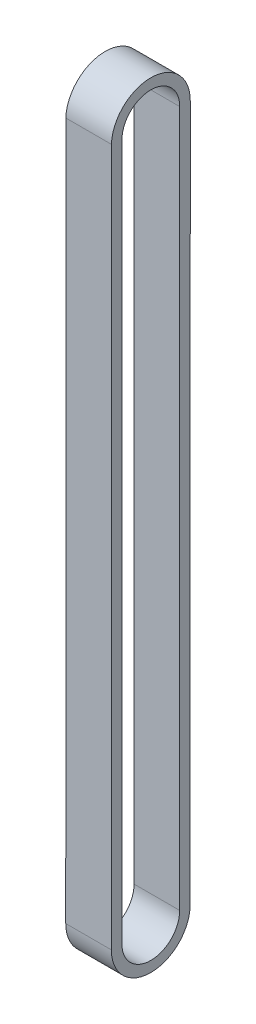
ISO-10303-21;
HEADER;
FILE_DESCRIPTION(('STEP AP214'),'2;1');
FILE_NAME('part.step','',(''),(''),'','','');
FILE_SCHEMA(('AUTOMOTIVE_DESIGN { 1 0 10303 214 1 1 1 1 }'));
ENDSEC;
DATA;
#1=APPLICATION_CONTEXT('core data for automotive mechanical design processes');
#2=APPLICATION_PROTOCOL_DEFINITION('international standard','automotive_design',2000,#1);
#3=PRODUCT_CONTEXT('',#1,'mechanical');
#4=PRODUCT('Part','Part','',(#3));
#5=PRODUCT_RELATED_PRODUCT_CATEGORY('part','',(#4));
#6=PRODUCT_DEFINITION_FORMATION('','',#4);
#7=PRODUCT_DEFINITION_CONTEXT('part definition',#1,'design');
#8=PRODUCT_DEFINITION('design','',#6,#7);
#9=PRODUCT_DEFINITION_SHAPE('','',#8);
#10=(LENGTH_UNIT() NAMED_UNIT(*) SI_UNIT(.MILLI.,.METRE.));
#11=(NAMED_UNIT(*) PLANE_ANGLE_UNIT() SI_UNIT($,.RADIAN.));
#12=(NAMED_UNIT(*) SI_UNIT($,.STERADIAN.) SOLID_ANGLE_UNIT());
#13=UNCERTAINTY_MEASURE_WITH_UNIT(LENGTH_MEASURE(1.E-05),#10,'distance_accuracy_value','');
#14=(GEOMETRIC_REPRESENTATION_CONTEXT(3) GLOBAL_UNCERTAINTY_ASSIGNED_CONTEXT((#13)) GLOBAL_UNIT_ASSIGNED_CONTEXT((#10,
#11,#12)) REPRESENTATION_CONTEXT('',''));
#15=CARTESIAN_POINT('',(0.,0.,0.));
#16=DIRECTION('',(0.,0.,1.));
#17=DIRECTION('',(1.,0.,0.));
#18=AXIS2_PLACEMENT_3D('',#15,#16,#17);
#19=CARTESIAN_POINT('',(33.512699999993,38.227,-15.9857116295923));
#20=DIRECTION('',(0.,-5.05876864481122E-05,-0.999999998720443));
#21=DIRECTION('',(0.,0.999999998720443,-5.05876864481122E-05));
#22=AXIS2_PLACEMENT_3D('',#19,#20,#21);
#23=PLANE('',#22);
#24=DIRECTION('',(1.,0.,0.));
#25=VECTOR('',#24,1.);
#26=CARTESIAN_POINT('',(33.512699999993,38.227,-15.9857116295927));
#27=LINE('',#26,#25);
#28=CARTESIAN_POINT('',(33.512699999993,38.2269999999941,-15.9857116295925));
#29=VERTEX_POINT('',#28);
#30=CARTESIAN_POINT('',(52.0126999999952,38.2269999999941,-15.9857116295925));
#31=VERTEX_POINT('',#30);
#32=EDGE_CURVE('E74',#29,#31,#27,.T.);
#33=ORIENTED_EDGE('',*,*,#32,.F.);
#34=DIRECTION('',(0.,0.999999998720443,-5.05876864496959E-05));
#35=VECTOR('',#34,1.);
#36=CARTESIAN_POINT('',(33.512699999993,38.227,-15.9857116295923));
#37=LINE('',#36,#35);
#38=CARTESIAN_POINT('',(33.512699999993,320.674190597006,-15.9999999795268));
#39=VERTEX_POINT('',#38);
#40=EDGE_CURVE('E151',#29,#39,#37,.T.);
#41=ORIENTED_EDGE('',*,*,#40,.T.);
#42=DIRECTION('',(1.,0.,0.));
#43=VECTOR('',#42,1.);
#44=CARTESIAN_POINT('',(33.512699999993,320.674190596996,-15.9999999795266));
#45=LINE('',#44,#43);
#46=CARTESIAN_POINT('',(52.0126999999952,320.674190597006,-15.9999999795268));
#47=VERTEX_POINT('',#46);
#48=EDGE_CURVE('E137',#47,#39,#45,.F.);
#49=ORIENTED_EDGE('',*,*,#48,.F.);
#50=DIRECTION('',(0.,0.999999998720443,-5.05876864496959E-05));
#51=VECTOR('',#50,1.);
#52=CARTESIAN_POINT('',(52.0126999999952,38.227,-15.9857116295923));
#53=LINE('',#52,#51);
#54=EDGE_CURVE('E77',#31,#47,#53,.T.);
#55=ORIENTED_EDGE('',*,*,#54,.F.);
#56=EDGE_LOOP('',(#33,#41,#49,#55));
#57=FACE_BOUND('',#56,.T.);
#58=ADVANCED_FACE('F16',(#57),#23,.T.);
#59=CARTESIAN_POINT('',(33.512699999993,320.675,-11.7261501943786));
#60=DIRECTION('',(0.,5.05876333767923E-05,0.999999998720446));
#61=DIRECTION('',(0.,-0.999999998720446,5.05876333767923E-05));
#62=AXIS2_PLACEMENT_3D('',#59,#60,#61);
#63=PLANE('',#62);
#64=CARTESIAN_POINT('',(52.0126999999952,320.674406801796,-11.7261501793744));
#65=CARTESIAN_POINT('',(51.2418666666618,320.674431518387,-11.7261501806247));
#66=CARTESIAN_POINT('',(50.4710333333283,320.674456234979,-11.726150181797));
#67=CARTESIAN_POINT('',(48.9293666666615,320.674505668163,-11.7261501839851));
#68=CARTESIAN_POINT('',(48.1585333333281,320.674530384755,-11.726150185001));
#69=CARTESIAN_POINT('',(46.6168666666612,320.674579817938,-11.7261501868765));
#70=CARTESIAN_POINT('',(45.8460333333278,320.67460453453,-11.7261501877361));
#71=CARTESIAN_POINT('',(44.3043666666609,320.674653967714,-11.7261501892991));
#72=CARTESIAN_POINT('',(43.5335333333275,320.674678684306,-11.7261501900024));
#73=CARTESIAN_POINT('',(41.9918666666607,320.67472811749,-11.7261501912528));
#74=CARTESIAN_POINT('',(41.2210333333272,320.674752834081,-11.7261501917998));
#75=CARTESIAN_POINT('',(39.6793666666604,320.674802267265,-11.7261501927376));
#76=CARTESIAN_POINT('',(38.908533333327,320.674826983857,-11.7261501931283));
#77=CARTESIAN_POINT('',(37.3668666666601,320.674876417041,-11.7261501937535));
#78=CARTESIAN_POINT('',(36.5960333333267,320.674901133633,-11.7261501939879));
#79=CARTESIAN_POINT('',(35.0543666666598,320.674950566816,-11.7261501943005));
#80=CARTESIAN_POINT('',(34.2835333333264,320.674975283408,-11.7261501943786));
#81=CARTESIAN_POINT('',(33.512699999993,320.675,-11.7261501943786));
#82=B_SPLINE_CURVE_WITH_KNOTS('',3,(#64,#65,#66,#67,#68,#69,#70,#71,#72,#73,#74,#75,#76,#77,#78,
#79,#80,#81),.UNSPECIFIED.,.F.,.F.,(4,2,2,2,2,2,2,2,4),(0.,2.31250000118907,4.62500000237814,
6.93750000356722,9.25000000475629,11.5625000059454,13.8750000071344,16.1875000083235,
18.5000000095126),.UNSPECIFIED.);
#83=CARTESIAN_POINT('',(52.0126999999952,320.674406801805,-11.726150175623));
#84=VERTEX_POINT('',#83);
#85=CARTESIAN_POINT('',(33.512699999993,320.675,-11.7261501943786));
#86=VERTEX_POINT('',#85);
#87=EDGE_CURVE('E102',#84,#86,#82,.T.);
#88=ORIENTED_EDGE('',*,*,#87,.T.);
#89=DIRECTION('',(0.,-0.999999998720446,5.05876333795116E-05));
#90=VECTOR('',#89,1.);
#91=CARTESIAN_POINT('',(33.512699999993,320.675,-11.7261501943786));
#92=LINE('',#91,#90);
#93=CARTESIAN_POINT('',(33.512699999993,38.227,-11.7118618184879));
#94=VERTEX_POINT('',#93);
#95=EDGE_CURVE('E149',#86,#94,#92,.T.);
#96=ORIENTED_EDGE('',*,*,#95,.T.);
#97=CARTESIAN_POINT('',(33.512699999993,38.227,-11.7118618184883));
#98=CARTESIAN_POINT('',(34.2835333333264,38.2269752834092,-11.7118618184883));
#99=CARTESIAN_POINT('',(35.0543666666598,38.2269505668184,-11.7118618184102));
#100=CARTESIAN_POINT('',(36.5960333333267,38.2269011336368,-11.7118618180976));
#101=CARTESIAN_POINT('',(37.3668666666601,38.226876417046,-11.7118618178631));
#102=CARTESIAN_POINT('',(38.908533333327,38.2268269838644,-11.711861817238));
#103=CARTESIAN_POINT('',(39.6793666666604,38.2268022672736,-11.7118618168472));
#104=CARTESIAN_POINT('',(41.2210333333272,38.226752834092,-11.7118618159094));
#105=CARTESIAN_POINT('',(41.9918666666607,38.2267281175012,-11.7118618153624));
#106=CARTESIAN_POINT('',(43.5335333333275,38.2266786843196,-11.7118618141121));
#107=CARTESIAN_POINT('',(44.3043666666609,38.2266539677288,-11.7118618134087));
#108=CARTESIAN_POINT('',(45.8460333333278,38.2266045345472,-11.7118618118458));
#109=CARTESIAN_POINT('',(46.6168666666612,38.2265798179565,-11.7118618109862));
#110=CARTESIAN_POINT('',(48.1585333333281,38.2265303847749,-11.7118618091107));
#111=CARTESIAN_POINT('',(48.9293666666615,38.2265056681841,-11.7118618080947));
#112=CARTESIAN_POINT('',(50.4710333333283,38.2264562350026,-11.7118618059066));
#113=CARTESIAN_POINT('',(51.2418666666618,38.2264315184118,-11.7118618047344));
#114=CARTESIAN_POINT('',(52.0126999999952,38.226406801821,-11.7118618034841));
#115=B_SPLINE_CURVE_WITH_KNOTS('',3,(#97,#98,#99,#100,#101,#102,#103,#104,#105,#106,#107,#108,
#109,#110,#111,#112,#113,#114),.UNSPECIFIED.,.F.,.F.,(4,2,2,2,2,2,2,2,4),(0.,2.31250000118907,
4.62500000237814,6.93750000356722,9.25000000475629,11.5625000059454,13.8750000071344,
16.1875000083235,18.5000000095126),.UNSPECIFIED.);
#116=CARTESIAN_POINT('',(52.0126999999952,38.2264068018173,-11.7118617997336));
#117=VERTEX_POINT('',#116);
#118=EDGE_CURVE('E133',#94,#117,#115,.T.);
#119=ORIENTED_EDGE('',*,*,#118,.T.);
#120=DIRECTION('',(0.,-0.999999998720446,5.05876333705247E-05));
#121=VECTOR('',#120,1.);
#122=CARTESIAN_POINT('',(52.0126999999952,320.674406801796,-11.7261501718717));
#123=LINE('',#122,#121);
#124=EDGE_CURVE('E94',#84,#117,#123,.T.);
#125=ORIENTED_EDGE('',*,*,#124,.F.);
#126=EDGE_LOOP('',(#88,#96,#119,#125));
#127=FACE_BOUND('',#126,.T.);
#128=ADVANCED_FACE('F130',(#127),#63,.T.);
#129=CARTESIAN_POINT('',(33.512699999993,38.227,0.0142883758903336));
#130=DIRECTION('',(1.,0.,0.));
#131=DIRECTION('',(0.,0.,-1.));
#132=AXIS2_PLACEMENT_3D('',#129,#130,#131);
#133=CYLINDRICAL_SURFACE('',#132,11.7261501943786);
#134=CARTESIAN_POINT('',(52.0126999999952,38.227,0.0142883758903336));
#135=DIRECTION('',(1.,0.,0.));
#136=DIRECTION('',(0.,0.,-1.));
#137=AXIS2_PLACEMENT_3D('',#134,#135,#136);
#138=CIRCLE('',#137,11.7261501943786);
#139=CARTESIAN_POINT('',(52.0126999999952,38.227593198656,11.7404385552584));
#140=VERTEX_POINT('',#139);
#141=EDGE_CURVE('E76',#117,#140,#138,.F.);
#142=ORIENTED_EDGE('',*,*,#141,.F.);
#143=ORIENTED_EDGE('',*,*,#118,.F.);
#144=CARTESIAN_POINT('',(33.512699999993,38.227,0.0142883758903336));
#145=DIRECTION('',(1.,0.,0.));
#146=DIRECTION('',(0.,0.,-1.));
#147=AXIS2_PLACEMENT_3D('',#144,#145,#146);
#148=CIRCLE('',#147,11.7261501943786);
#149=CARTESIAN_POINT('',(33.512699999993,38.2275748756092,11.7404385561775));
#150=VERTEX_POINT('',#149);
#151=EDGE_CURVE('E146',#94,#150,#148,.F.);
#152=ORIENTED_EDGE('',*,*,#151,.T.);
#153=DIRECTION('',(-0.99999999999951,-9.90443480608502E-07,5.01042525786989E-11));
#154=VECTOR('',#153,1.);
#155=CARTESIAN_POINT('',(52.0126999999952,38.2275931988136,11.7404385552509));
#156=LINE('',#155,#154);
#157=EDGE_CURVE('E136',#140,#150,#156,.T.);
#158=ORIENTED_EDGE('',*,*,#157,.F.);
#159=EDGE_LOOP('',(#142,#143,#152,#158));
#160=FACE_BOUND('',#159,.T.);
#161=ADVANCED_FACE('F126',(#160),#133,.F.);
#162=CARTESIAN_POINT('',(33.512699999993,38.2275748756092,11.7404385561778));
#163=DIRECTION('',(0.,-5.05876864483622E-05,-0.999999998720443));
#164=DIRECTION('',(0.,0.999999998720443,-5.05876864483622E-05));
#165=AXIS2_PLACEMENT_3D('',#162,#163,#164);
#166=PLANE('',#165);
#167=ORIENTED_EDGE('',*,*,#157,.T.);
#168=DIRECTION('',(0.,0.999999998720443,-5.05876864501952E-05));
#169=VECTOR('',#168,1.);
#170=CARTESIAN_POINT('',(33.512699999993,38.2275748756092,11.7404385561778));
#171=LINE('',#170,#169);
#172=CARTESIAN_POINT('',(33.512699999993,320.675,11.7261501943786));
#173=VERTEX_POINT('',#172);
#174=EDGE_CURVE('E90',#150,#173,#171,.T.);
#175=ORIENTED_EDGE('',*,*,#174,.T.);
#176=CARTESIAN_POINT('',(33.512699999993,320.675,11.7261501943786));
#177=CARTESIAN_POINT('',(34.2835333333264,320.675024716613,11.7261501943786));
#178=CARTESIAN_POINT('',(35.0543666666598,320.675049433226,11.7261501943005));
#179=CARTESIAN_POINT('',(36.5960333333267,320.675098866452,11.7261501939879));
#180=CARTESIAN_POINT('',(37.3668666666601,320.675123583065,11.7261501937535));
#181=CARTESIAN_POINT('',(38.908533333327,320.675173016291,11.7261501931283));
#182=CARTESIAN_POINT('',(39.6793666666604,320.675197732904,11.7261501927375));
#183=CARTESIAN_POINT('',(41.2210333333272,320.67524716613,11.7261501917998));
#184=CARTESIAN_POINT('',(41.9918666666607,320.675271882743,11.7261501912528));
#185=CARTESIAN_POINT('',(43.5335333333275,320.675321315969,11.7261501900024));
#186=CARTESIAN_POINT('',(44.3043666666609,320.675346032582,11.7261501892991));
#187=CARTESIAN_POINT('',(45.8460333333278,320.675395465808,11.7261501877361));
#188=CARTESIAN_POINT('',(46.6168666666612,320.675420182421,11.7261501868765));
#189=CARTESIAN_POINT('',(48.1585333333281,320.675469615647,11.726150185001));
#190=CARTESIAN_POINT('',(48.9293666666615,320.67549433226,11.7261501839851));
#191=CARTESIAN_POINT('',(50.4710333333283,320.675543765486,11.7261501817969));
#192=CARTESIAN_POINT('',(51.2418666666618,320.675568482099,11.7261501806247));
#193=CARTESIAN_POINT('',(52.0126999999952,320.675593198712,11.7261501793744));
#194=B_SPLINE_CURVE_WITH_KNOTS('',3,(#176,#177,#178,#179,#180,#181,#182,#183,#184,#185,#186,
#187,#188,#189,#190,#191,#192,#193),.UNSPECIFIED.,.F.,.F.,(4,2,2,2,2,2,2,2,4),(0.,
2.31250000118907,4.62500000237814,6.93750000356722,9.25000000475629,11.5625000059454,
13.8750000071344,16.1875000083235,18.5000000095126),.UNSPECIFIED.);
#195=CARTESIAN_POINT('',(52.0126999999952,320.675593198605,11.726150175623));
#196=VERTEX_POINT('',#195);
#197=EDGE_CURVE('E107',#173,#196,#194,.T.);
#198=ORIENTED_EDGE('',*,*,#197,.T.);
#199=DIRECTION('',(0.,0.999999998720445,-5.05876599442825E-05));
#200=VECTOR('',#199,1.);
#201=CARTESIAN_POINT('',(52.0126999999952,38.2275931988136,11.7404385552659));
#202=LINE('',#201,#200);
#203=EDGE_CURVE('E98',#140,#196,#202,.T.);
#204=ORIENTED_EDGE('',*,*,#203,.F.);
#205=EDGE_LOOP('',(#167,#175,#198,#204));
#206=FACE_BOUND('',#205,.T.);
#207=ADVANCED_FACE('F120',(#206),#166,.T.);
#208=CARTESIAN_POINT('',(33.512699999993,320.675,0.));
#209=DIRECTION('',(1.,0.,0.));
#210=DIRECTION('',(0.,0.,-1.));
#211=AXIS2_PLACEMENT_3D('',#208,#209,#210);
#212=CYLINDRICAL_SURFACE('',#211,11.7261501943786);
#213=CARTESIAN_POINT('',(52.0126999999952,320.675,0.));
#214=DIRECTION('',(1.,0.,0.));
#215=DIRECTION('',(0.,0.,-1.));
#216=AXIS2_PLACEMENT_3D('',#213,#214,#215);
#217=CIRCLE('',#216,11.7261501943786);
#218=EDGE_CURVE('E97',#196,#84,#217,.F.);
#219=ORIENTED_EDGE('',*,*,#218,.F.);
#220=ORIENTED_EDGE('',*,*,#197,.F.);
#221=CARTESIAN_POINT('',(33.512699999993,320.675,0.));
#222=DIRECTION('',(1.,0.,0.));
#223=DIRECTION('',(0.,0.,-1.));
#224=AXIS2_PLACEMENT_3D('',#221,#222,#223);
#225=CIRCLE('',#224,11.7261501943786);
#226=EDGE_CURVE('E87',#173,#86,#225,.F.);
#227=ORIENTED_EDGE('',*,*,#226,.T.);
#228=ORIENTED_EDGE('',*,*,#87,.F.);
#229=EDGE_LOOP('',(#219,#220,#227,#228));
#230=FACE_BOUND('',#229,.T.);
#231=ADVANCED_FACE('F110',(#230),#212,.F.);
#232=CARTESIAN_POINT('',(33.512699999993,38.2278095041468,0.016288349931838));
#233=DIRECTION('',(1.,0.,0.));
#234=DIRECTION('',(0.,0.,-1.));
#235=AXIS2_PLACEMENT_3D('',#232,#233,#234);
#236=CYLINDRICAL_SURFACE('',#235,16.002);
#237=DIRECTION('',(1.,0.,0.));
#238=VECTOR('',#237,1.);
#239=CARTESIAN_POINT('',(33.512699999993,38.227,16.0182883294556));
#240=LINE('',#239,#238);
#241=CARTESIAN_POINT('',(33.512699999993,38.227,16.018288329456));
#242=VERTEX_POINT('',#241);
#243=CARTESIAN_POINT('',(52.0126999999952,38.227,16.018288329456));
#244=VERTEX_POINT('',#243);
#245=EDGE_CURVE('E72',#242,#244,#240,.T.);
#246=ORIENTED_EDGE('',*,*,#245,.F.);
#247=CARTESIAN_POINT('',(33.512699999993,38.2278095041468,0.016288349931838));
#248=DIRECTION('',(1.,0.,0.));
#249=DIRECTION('',(0.,0.,-1.));
#250=AXIS2_PLACEMENT_3D('',#247,#248,#249);
#251=CIRCLE('',#250,16.002);
#252=EDGE_CURVE('E144',#242,#29,#251,.T.);
#253=ORIENTED_EDGE('',*,*,#252,.T.);
#254=ORIENTED_EDGE('',*,*,#32,.T.);
#255=CARTESIAN_POINT('',(52.0126999999952,38.2278095041468,0.016288349931838));
#256=DIRECTION('',(1.,0.,0.));
#257=DIRECTION('',(0.,0.,-1.));
#258=AXIS2_PLACEMENT_3D('',#255,#256,#257);
#259=CIRCLE('',#258,16.002);
#260=EDGE_CURVE('E19',#244,#31,#259,.T.);
#261=ORIENTED_EDGE('',*,*,#260,.F.);
#262=EDGE_LOOP('',(#246,#253,#254,#261));
#263=FACE_BOUND('',#262,.T.);
#264=ADVANCED_FACE('F69',(#263),#236,.T.);
#265=CARTESIAN_POINT('',(52.0126999999952,320.675,0.));
#266=DIRECTION('',(1.,0.,0.));
#267=DIRECTION('',(0.,0.,-1.));
#268=AXIS2_PLACEMENT_3D('',#265,#266,#267);
#269=PLANE('',#268);
#270=ORIENTED_EDGE('',*,*,#218,.T.);
#271=ORIENTED_EDGE('',*,*,#124,.T.);
#272=ORIENTED_EDGE('',*,*,#141,.T.);
#273=ORIENTED_EDGE('',*,*,#203,.T.);
#274=EDGE_LOOP('',(#270,#271,#272,#273));
#275=FACE_BOUND('',#274,.T.);
#276=DIRECTION('',(0.,-0.9999999947009,0.0001029475638485));
#277=VECTOR('',#276,1.);
#278=CARTESIAN_POINT('',(52.0126999999952,321.264127486716,15.9891503465477));
#279=LINE('',#278,#277);
#280=CARTESIAN_POINT('',(52.0126999999952,321.264127486662,15.9891503465477));
#281=VERTEX_POINT('',#280);
#282=EDGE_CURVE('E79',#244,#281,#279,.F.);
#283=ORIENTED_EDGE('',*,*,#282,.F.);
#284=ORIENTED_EDGE('',*,*,#260,.T.);
#285=ORIENTED_EDGE('',*,*,#54,.T.);
#286=CARTESIAN_POINT('',(52.0126999999952,320.675,0.));
#287=DIRECTION('',(1.,0.,0.));
#288=DIRECTION('',(0.,0.,-1.));
#289=AXIS2_PLACEMENT_3D('',#286,#287,#288);
#290=CIRCLE('',#289,15.9999999999995);
#291=EDGE_CURVE('E82',#281,#47,#290,.F.);
#292=ORIENTED_EDGE('',*,*,#291,.F.);
#293=EDGE_LOOP('',(#283,#284,#285,#292));
#294=FACE_BOUND('',#293,.T.);
#295=ADVANCED_FACE('F80',(#275,#294),#269,.T.);
#296=CARTESIAN_POINT('',(33.512699999993,320.675,0.));
#297=DIRECTION('',(1.,0.,0.));
#298=DIRECTION('',(0.,0.,-1.));
#299=AXIS2_PLACEMENT_3D('',#296,#297,#298);
#300=CYLINDRICAL_SURFACE('',#299,15.9999999999995);
#301=ORIENTED_EDGE('',*,*,#48,.T.);
#302=CARTESIAN_POINT('',(33.512699999993,320.675,0.));
#303=DIRECTION('',(1.,0.,0.));
#304=DIRECTION('',(0.,0.,-1.));
#305=AXIS2_PLACEMENT_3D('',#302,#303,#304);
#306=CIRCLE('',#305,15.9999999999995);
#307=CARTESIAN_POINT('',(33.512699999993,321.264127486662,15.9891503465477));
#308=VERTEX_POINT('',#307);
#309=EDGE_CURVE('E34',#39,#308,#306,.T.);
#310=ORIENTED_EDGE('',*,*,#309,.T.);
#311=DIRECTION('',(1.,0.,0.));
#312=VECTOR('',#311,1.);
#313=CARTESIAN_POINT('',(33.512699999993,321.264127486716,15.9891503465477));
#314=LINE('',#313,#312);
#315=EDGE_CURVE('E25',#281,#308,#314,.F.);
#316=ORIENTED_EDGE('',*,*,#315,.F.);
#317=ORIENTED_EDGE('',*,*,#291,.T.);
#318=EDGE_LOOP('',(#301,#310,#316,#317));
#319=FACE_BOUND('',#318,.T.);
#320=ADVANCED_FACE('F180',(#319),#300,.T.);
#321=CARTESIAN_POINT('',(33.512699999993,0.,0.));
#322=DIRECTION('',(1.,0.,0.));
#323=DIRECTION('',(0.,0.,-1.));
#324=AXIS2_PLACEMENT_3D('',#321,#322,#323);
#325=PLANE('',#324);
#326=ORIENTED_EDGE('',*,*,#174,.F.);
#327=ORIENTED_EDGE('',*,*,#151,.F.);
#328=ORIENTED_EDGE('',*,*,#95,.F.);
#329=ORIENTED_EDGE('',*,*,#226,.F.);
#330=EDGE_LOOP('',(#326,#327,#328,#329));
#331=FACE_BOUND('',#330,.T.);
#332=ORIENTED_EDGE('',*,*,#309,.F.);
#333=ORIENTED_EDGE('',*,*,#40,.F.);
#334=ORIENTED_EDGE('',*,*,#252,.F.);
#335=DIRECTION('',(0.,-0.9999999947009,0.0001029475638485));
#336=VECTOR('',#335,1.);
#337=CARTESIAN_POINT('',(33.512699999993,321.264127486716,15.9891503465477));
#338=LINE('',#337,#336);
#339=EDGE_CURVE('E11',#308,#242,#338,.T.);
#340=ORIENTED_EDGE('',*,*,#339,.F.);
#341=EDGE_LOOP('',(#332,#333,#334,#340));
#342=FACE_BOUND('',#341,.T.);
#343=ADVANCED_FACE('F186',(#331,#342),#325,.F.);
#344=CARTESIAN_POINT('',(33.512699999993,321.264127486716,15.9891503465477));
#345=DIRECTION('',(0.,0.0001029475638485,0.9999999947009));
#346=DIRECTION('',(0.,-0.9999999947009,0.0001029475638485));
#347=AXIS2_PLACEMENT_3D('',#344,#345,#346);
#348=PLANE('',#347);
#349=ORIENTED_EDGE('',*,*,#315,.T.);
#350=ORIENTED_EDGE('',*,*,#339,.T.);
#351=ORIENTED_EDGE('',*,*,#245,.T.);
#352=ORIENTED_EDGE('',*,*,#282,.T.);
#353=EDGE_LOOP('',(#349,#350,#351,#352));
#354=FACE_BOUND('',#353,.T.);
#355=ADVANCED_FACE('F86',(#354),#348,.T.);
#356=CLOSED_SHELL('',(#58,#128,#161,#207,#231,#264,#295,#320,#343,#355));
#357=MANIFOLD_SOLID_BREP('B1',#356);
#358=ADVANCED_BREP_SHAPE_REPRESENTATION('',(#18,#357),#14);
#359=SHAPE_DEFINITION_REPRESENTATION(#9,#358);
ENDSEC;
END-ISO-10303-21;
